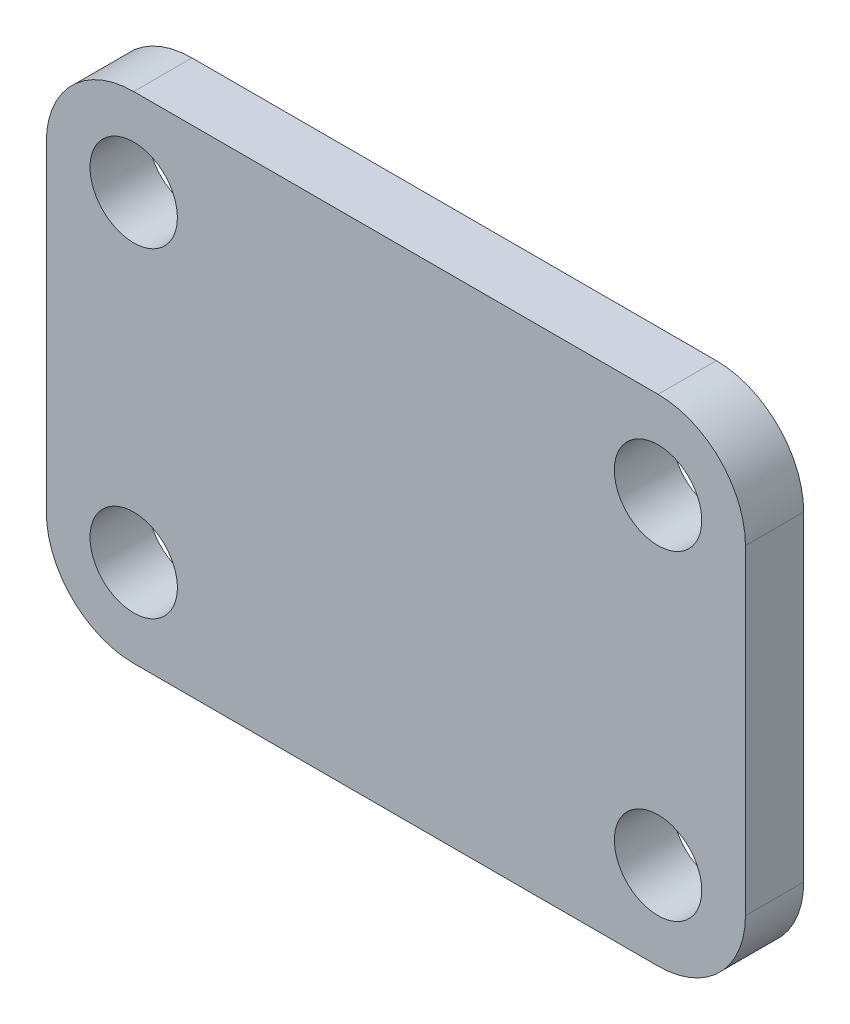
ISO-10303-21;
HEADER;
FILE_DESCRIPTION(('STEP AP214'),'2;1');
FILE_NAME('part.step','',(''),(''),'','','');
FILE_SCHEMA(('AUTOMOTIVE_DESIGN { 1 0 10303 214 1 1 1 1 }'));
ENDSEC;
DATA;
#1=APPLICATION_CONTEXT('core data for automotive mechanical design processes');
#2=APPLICATION_PROTOCOL_DEFINITION('international standard','automotive_design',2000,#1);
#3=PRODUCT_CONTEXT('',#1,'mechanical');
#4=PRODUCT('Part','Part','',(#3));
#5=PRODUCT_RELATED_PRODUCT_CATEGORY('part','',(#4));
#6=PRODUCT_DEFINITION_FORMATION('','',#4);
#7=PRODUCT_DEFINITION_CONTEXT('part definition',#1,'design');
#8=PRODUCT_DEFINITION('design','',#6,#7);
#9=PRODUCT_DEFINITION_SHAPE('','',#8);
#10=(LENGTH_UNIT() NAMED_UNIT(*) SI_UNIT(.MILLI.,.METRE.));
#11=(NAMED_UNIT(*) PLANE_ANGLE_UNIT() SI_UNIT($,.RADIAN.));
#12=(NAMED_UNIT(*) SI_UNIT($,.STERADIAN.) SOLID_ANGLE_UNIT());
#13=UNCERTAINTY_MEASURE_WITH_UNIT(LENGTH_MEASURE(1.E-05),#10,'distance_accuracy_value','');
#14=(GEOMETRIC_REPRESENTATION_CONTEXT(3) GLOBAL_UNCERTAINTY_ASSIGNED_CONTEXT((#13)) GLOBAL_UNIT_ASSIGNED_CONTEXT((#10,
#11,#12)) REPRESENTATION_CONTEXT('',''));
#15=CARTESIAN_POINT('',(0.,0.,0.));
#16=DIRECTION('',(0.,0.,1.));
#17=DIRECTION('',(1.,0.,0.));
#18=AXIS2_PLACEMENT_3D('',#15,#16,#17);
#19=CARTESIAN_POINT('',(0.,0.,1.));
#20=DIRECTION('',(0.,0.,1.));
#21=DIRECTION('',(1.,0.,0.));
#22=AXIS2_PLACEMENT_3D('',#19,#20,#21);
#23=PLANE('',#22);
#24=CARTESIAN_POINT('',(9.,-5.5,1.));
#25=DIRECTION('',(0.,0.,1.));
#26=DIRECTION('',(1.,0.,0.));
#27=AXIS2_PLACEMENT_3D('',#24,#25,#26);
#28=CIRCLE('',#27,1.5);
#29=CARTESIAN_POINT('',(10.5,-5.5,1.));
#30=VERTEX_POINT('',#29);
#31=EDGE_CURVE('E188',#30,#30,#28,.T.);
#32=ORIENTED_EDGE('',*,*,#31,.F.);
#33=EDGE_LOOP('',(#32));
#34=FACE_BOUND('',#33,.T.);
#35=CARTESIAN_POINT('',(-9.,5.5,1.));
#36=DIRECTION('',(0.,0.,1.));
#37=DIRECTION('',(1.,0.,0.));
#38=AXIS2_PLACEMENT_3D('',#35,#36,#37);
#39=CIRCLE('',#38,1.5);
#40=CARTESIAN_POINT('',(-7.5,5.5,1.));
#41=VERTEX_POINT('',#40);
#42=EDGE_CURVE('E129',#41,#41,#39,.T.);
#43=ORIENTED_EDGE('',*,*,#42,.F.);
#44=EDGE_LOOP('',(#43));
#45=FACE_BOUND('',#44,.T.);
#46=DIRECTION('',(1.,0.,0.));
#47=VECTOR('',#46,1.);
#48=CARTESIAN_POINT('',(-12.,-8.5,1.));
#49=LINE('',#48,#47);
#50=CARTESIAN_POINT('',(-9.,-8.5,1.));
#51=VERTEX_POINT('',#50);
#52=CARTESIAN_POINT('',(9.,-8.5,1.));
#53=VERTEX_POINT('',#52);
#54=EDGE_CURVE('E138',#51,#53,#49,.T.);
#55=ORIENTED_EDGE('',*,*,#54,.T.);
#56=CARTESIAN_POINT('',(9.00000000000001,-5.5,1.));
#57=DIRECTION('',(0.,0.,1.));
#58=DIRECTION('',(1.,0.,0.));
#59=AXIS2_PLACEMENT_3D('',#56,#57,#58);
#60=CIRCLE('',#59,3.);
#61=CARTESIAN_POINT('',(12.,-5.5,1.));
#62=VERTEX_POINT('',#61);
#63=EDGE_CURVE('E157',#53,#62,#60,.T.);
#64=ORIENTED_EDGE('',*,*,#63,.T.);
#65=DIRECTION('',(0.,1.,0.));
#66=VECTOR('',#65,1.);
#67=CARTESIAN_POINT('',(12.,8.5,1.));
#68=LINE('',#67,#66);
#69=CARTESIAN_POINT('',(12.,5.5,1.));
#70=VERTEX_POINT('',#69);
#71=EDGE_CURVE('E121',#62,#70,#68,.T.);
#72=ORIENTED_EDGE('',*,*,#71,.T.);
#73=CARTESIAN_POINT('',(9.00000000000001,5.5,1.));
#74=DIRECTION('',(0.,0.,1.));
#75=DIRECTION('',(1.,0.,0.));
#76=AXIS2_PLACEMENT_3D('',#73,#74,#75);
#77=CIRCLE('',#76,3.);
#78=CARTESIAN_POINT('',(9.00000000000001,8.5,1.));
#79=VERTEX_POINT('',#78);
#80=EDGE_CURVE('E152',#70,#79,#77,.T.);
#81=ORIENTED_EDGE('',*,*,#80,.T.);
#82=DIRECTION('',(-1.,0.,0.));
#83=VECTOR('',#82,1.);
#84=CARTESIAN_POINT('',(-12.,8.5,1.));
#85=LINE('',#84,#83);
#86=CARTESIAN_POINT('',(-9.,8.5,1.));
#87=VERTEX_POINT('',#86);
#88=EDGE_CURVE('E168',#79,#87,#85,.T.);
#89=ORIENTED_EDGE('',*,*,#88,.T.);
#90=CARTESIAN_POINT('',(-9.,5.5,1.));
#91=DIRECTION('',(0.,0.,1.));
#92=DIRECTION('',(1.,0.,0.));
#93=AXIS2_PLACEMENT_3D('',#90,#91,#92);
#94=CIRCLE('',#93,3.);
#95=CARTESIAN_POINT('',(-12.,5.5,1.));
#96=VERTEX_POINT('',#95);
#97=EDGE_CURVE('E57',#87,#96,#94,.T.);
#98=ORIENTED_EDGE('',*,*,#97,.T.);
#99=DIRECTION('',(0.,-1.,0.));
#100=VECTOR('',#99,1.);
#101=CARTESIAN_POINT('',(-12.,8.5,1.));
#102=LINE('',#101,#100);
#103=CARTESIAN_POINT('',(-12.,-5.5,1.));
#104=VERTEX_POINT('',#103);
#105=EDGE_CURVE('E176',#96,#104,#102,.T.);
#106=ORIENTED_EDGE('',*,*,#105,.T.);
#107=CARTESIAN_POINT('',(-9.,-5.5,1.));
#108=DIRECTION('',(0.,0.,1.));
#109=DIRECTION('',(1.,0.,0.));
#110=AXIS2_PLACEMENT_3D('',#107,#108,#109);
#111=CIRCLE('',#110,3.);
#112=EDGE_CURVE('E155',#104,#51,#111,.T.);
#113=ORIENTED_EDGE('',*,*,#112,.T.);
#114=EDGE_LOOP('',(#55,#64,#72,#81,#89,#98,#106,#113));
#115=FACE_BOUND('',#114,.T.);
#116=CARTESIAN_POINT('',(9.,5.5,1.));
#117=DIRECTION('',(0.,0.,1.));
#118=DIRECTION('',(-1.,0.,0.));
#119=AXIS2_PLACEMENT_3D('',#116,#117,#118);
#120=CIRCLE('',#119,1.5);
#121=CARTESIAN_POINT('',(7.5,5.5,1.));
#122=VERTEX_POINT('',#121);
#123=EDGE_CURVE('E183',#122,#122,#120,.T.);
#124=ORIENTED_EDGE('',*,*,#123,.F.);
#125=EDGE_LOOP('',(#124));
#126=FACE_BOUND('',#125,.T.);
#127=CARTESIAN_POINT('',(-9.,-5.5,1.));
#128=DIRECTION('',(0.,0.,1.));
#129=DIRECTION('',(-1.,0.,0.));
#130=AXIS2_PLACEMENT_3D('',#127,#128,#129);
#131=CIRCLE('',#130,1.5);
#132=CARTESIAN_POINT('',(-10.5,-5.5,1.));
#133=VERTEX_POINT('',#132);
#134=EDGE_CURVE('E194',#133,#133,#131,.T.);
#135=ORIENTED_EDGE('',*,*,#134,.F.);
#136=EDGE_LOOP('',(#135));
#137=FACE_BOUND('',#136,.T.);
#138=ADVANCED_FACE('F35',(#34,#45,#115,#126,#137),#23,.T.);
#139=CARTESIAN_POINT('',(0.,0.,-1.));
#140=DIRECTION('',(0.,0.,1.));
#141=DIRECTION('',(1.,0.,0.));
#142=AXIS2_PLACEMENT_3D('',#139,#140,#141);
#143=PLANE('',#142);
#144=CARTESIAN_POINT('',(9.,-5.5,-1.));
#145=DIRECTION('',(0.,0.,1.));
#146=DIRECTION('',(1.,0.,0.));
#147=AXIS2_PLACEMENT_3D('',#144,#145,#146);
#148=CIRCLE('',#147,1.5);
#149=CARTESIAN_POINT('',(10.5,-5.5,-1.));
#150=VERTEX_POINT('',#149);
#151=EDGE_CURVE('E191',#150,#150,#148,.T.);
#152=ORIENTED_EDGE('',*,*,#151,.T.);
#153=EDGE_LOOP('',(#152));
#154=FACE_BOUND('',#153,.T.);
#155=CARTESIAN_POINT('',(-9.,5.5,-1.));
#156=DIRECTION('',(0.,0.,1.));
#157=DIRECTION('',(1.,0.,0.));
#158=AXIS2_PLACEMENT_3D('',#155,#156,#157);
#159=CIRCLE('',#158,1.5);
#160=CARTESIAN_POINT('',(-7.5,5.5,-1.));
#161=VERTEX_POINT('',#160);
#162=EDGE_CURVE('E135',#161,#161,#159,.T.);
#163=ORIENTED_EDGE('',*,*,#162,.T.);
#164=EDGE_LOOP('',(#163));
#165=FACE_BOUND('',#164,.T.);
#166=DIRECTION('',(0.,1.,0.));
#167=VECTOR('',#166,1.);
#168=CARTESIAN_POINT('',(12.,8.5,-1.));
#169=LINE('',#168,#167);
#170=CARTESIAN_POINT('',(12.,-5.5,-1.));
#171=VERTEX_POINT('',#170);
#172=CARTESIAN_POINT('',(12.,5.5,-1.));
#173=VERTEX_POINT('',#172);
#174=EDGE_CURVE('E118',#171,#173,#169,.T.);
#175=ORIENTED_EDGE('',*,*,#174,.F.);
#176=CARTESIAN_POINT('',(9.00000000000001,-5.5,-1.));
#177=DIRECTION('',(0.,0.,1.));
#178=DIRECTION('',(1.,0.,0.));
#179=AXIS2_PLACEMENT_3D('',#176,#177,#178);
#180=CIRCLE('',#179,3.);
#181=CARTESIAN_POINT('',(9.,-8.5,-1.));
#182=VERTEX_POINT('',#181);
#183=EDGE_CURVE('E101',#171,#182,#180,.F.);
#184=ORIENTED_EDGE('',*,*,#183,.T.);
#185=DIRECTION('',(1.,0.,0.));
#186=VECTOR('',#185,1.);
#187=CARTESIAN_POINT('',(-12.,-8.5,-1.));
#188=LINE('',#187,#186);
#189=CARTESIAN_POINT('',(-9.,-8.5,-1.));
#190=VERTEX_POINT('',#189);
#191=EDGE_CURVE('E142',#190,#182,#188,.T.);
#192=ORIENTED_EDGE('',*,*,#191,.F.);
#193=CARTESIAN_POINT('',(-9.,-5.5,-1.));
#194=DIRECTION('',(0.,0.,1.));
#195=DIRECTION('',(1.,0.,0.));
#196=AXIS2_PLACEMENT_3D('',#193,#194,#195);
#197=CIRCLE('',#196,3.);
#198=CARTESIAN_POINT('',(-12.,-5.5,-1.));
#199=VERTEX_POINT('',#198);
#200=EDGE_CURVE('E112',#190,#199,#197,.F.);
#201=ORIENTED_EDGE('',*,*,#200,.T.);
#202=DIRECTION('',(0.,-1.,0.));
#203=VECTOR('',#202,1.);
#204=CARTESIAN_POINT('',(-12.,8.5,-1.));
#205=LINE('',#204,#203);
#206=CARTESIAN_POINT('',(-12.,5.5,-1.));
#207=VERTEX_POINT('',#206);
#208=EDGE_CURVE('E132',#207,#199,#205,.T.);
#209=ORIENTED_EDGE('',*,*,#208,.F.);
#210=CARTESIAN_POINT('',(-9.,5.5,-1.));
#211=DIRECTION('',(0.,0.,1.));
#212=DIRECTION('',(1.,0.,0.));
#213=AXIS2_PLACEMENT_3D('',#210,#211,#212);
#214=CIRCLE('',#213,3.);
#215=CARTESIAN_POINT('',(-9.,8.5,-1.));
#216=VERTEX_POINT('',#215);
#217=EDGE_CURVE('E146',#207,#216,#214,.F.);
#218=ORIENTED_EDGE('',*,*,#217,.T.);
#219=DIRECTION('',(-1.,0.,0.));
#220=VECTOR('',#219,1.);
#221=CARTESIAN_POINT('',(-12.,8.5,-1.));
#222=LINE('',#221,#220);
#223=CARTESIAN_POINT('',(9.00000000000001,8.5,-1.));
#224=VERTEX_POINT('',#223);
#225=EDGE_CURVE('E128',#224,#216,#222,.T.);
#226=ORIENTED_EDGE('',*,*,#225,.F.);
#227=CARTESIAN_POINT('',(9.00000000000001,5.5,-1.));
#228=DIRECTION('',(0.,0.,1.));
#229=DIRECTION('',(1.,0.,0.));
#230=AXIS2_PLACEMENT_3D('',#227,#228,#229);
#231=CIRCLE('',#230,3.);
#232=EDGE_CURVE('E122',#224,#173,#231,.F.);
#233=ORIENTED_EDGE('',*,*,#232,.T.);
#234=EDGE_LOOP('',(#175,#184,#192,#201,#209,#218,#226,#233));
#235=FACE_BOUND('',#234,.T.);
#236=CARTESIAN_POINT('',(9.,5.5,-1.));
#237=DIRECTION('',(0.,0.,1.));
#238=DIRECTION('',(-1.,0.,0.));
#239=AXIS2_PLACEMENT_3D('',#236,#237,#238);
#240=CIRCLE('',#239,1.5);
#241=CARTESIAN_POINT('',(7.5,5.5,-1.));
#242=VERTEX_POINT('',#241);
#243=EDGE_CURVE('E185',#242,#242,#240,.T.);
#244=ORIENTED_EDGE('',*,*,#243,.T.);
#245=EDGE_LOOP('',(#244));
#246=FACE_BOUND('',#245,.T.);
#247=CARTESIAN_POINT('',(-9.,-5.5,-1.));
#248=DIRECTION('',(0.,0.,1.));
#249=DIRECTION('',(-1.,0.,0.));
#250=AXIS2_PLACEMENT_3D('',#247,#248,#249);
#251=CIRCLE('',#250,1.5);
#252=CARTESIAN_POINT('',(-10.5,-5.5,-1.));
#253=VERTEX_POINT('',#252);
#254=EDGE_CURVE('E197',#253,#253,#251,.T.);
#255=ORIENTED_EDGE('',*,*,#254,.T.);
#256=EDGE_LOOP('',(#255));
#257=FACE_BOUND('',#256,.T.);
#258=ADVANCED_FACE('F125',(#154,#165,#235,#246,#257),#143,.F.);
#259=CARTESIAN_POINT('',(12.,8.5,1.));
#260=DIRECTION('',(-1.,0.,0.));
#261=DIRECTION('',(0.,-1.,0.));
#262=AXIS2_PLACEMENT_3D('',#259,#260,#261);
#263=PLANE('',#262);
#264=ORIENTED_EDGE('',*,*,#71,.F.);
#265=DIRECTION('',(0.,0.,-1.));
#266=VECTOR('',#265,1.);
#267=CARTESIAN_POINT('',(12.,-5.5,1.));
#268=LINE('',#267,#266);
#269=EDGE_CURVE('E105',#62,#171,#268,.T.);
#270=ORIENTED_EDGE('',*,*,#269,.T.);
#271=ORIENTED_EDGE('',*,*,#174,.T.);
#272=DIRECTION('',(0.,0.,-1.));
#273=VECTOR('',#272,1.);
#274=CARTESIAN_POINT('',(12.,5.5,1.));
#275=LINE('',#274,#273);
#276=EDGE_CURVE('E123',#173,#70,#275,.F.);
#277=ORIENTED_EDGE('',*,*,#276,.T.);
#278=EDGE_LOOP('',(#264,#270,#271,#277));
#279=FACE_BOUND('',#278,.T.);
#280=ADVANCED_FACE('F117',(#279),#263,.F.);
#281=CARTESIAN_POINT('',(-12.,8.5,1.));
#282=DIRECTION('',(0.,-1.,0.));
#283=DIRECTION('',(0.,0.,-1.));
#284=AXIS2_PLACEMENT_3D('',#281,#282,#283);
#285=PLANE('',#284);
#286=ORIENTED_EDGE('',*,*,#225,.T.);
#287=DIRECTION('',(0.,0.,-1.));
#288=VECTOR('',#287,1.);
#289=CARTESIAN_POINT('',(-9.,8.5,1.));
#290=LINE('',#289,#288);
#291=EDGE_CURVE('E11',#216,#87,#290,.F.);
#292=ORIENTED_EDGE('',*,*,#291,.T.);
#293=ORIENTED_EDGE('',*,*,#88,.F.);
#294=DIRECTION('',(0.,0.,-1.));
#295=VECTOR('',#294,1.);
#296=CARTESIAN_POINT('',(9.00000000000001,8.5,1.));
#297=LINE('',#296,#295);
#298=EDGE_CURVE('E43',#79,#224,#297,.T.);
#299=ORIENTED_EDGE('',*,*,#298,.T.);
#300=EDGE_LOOP('',(#286,#292,#293,#299));
#301=FACE_BOUND('',#300,.T.);
#302=ADVANCED_FACE('F166',(#301),#285,.F.);
#303=CARTESIAN_POINT('',(-12.,8.5,1.));
#304=DIRECTION('',(1.,0.,0.));
#305=DIRECTION('',(0.,0.,-1.));
#306=AXIS2_PLACEMENT_3D('',#303,#304,#305);
#307=PLANE('',#306);
#308=ORIENTED_EDGE('',*,*,#208,.T.);
#309=DIRECTION('',(0.,0.,-1.));
#310=VECTOR('',#309,1.);
#311=CARTESIAN_POINT('',(-12.,-5.5,1.));
#312=LINE('',#311,#310);
#313=EDGE_CURVE('E50',#199,#104,#312,.F.);
#314=ORIENTED_EDGE('',*,*,#313,.T.);
#315=ORIENTED_EDGE('',*,*,#105,.F.);
#316=DIRECTION('',(0.,0.,-1.));
#317=VECTOR('',#316,1.);
#318=CARTESIAN_POINT('',(-12.,5.5,1.));
#319=LINE('',#318,#317);
#320=EDGE_CURVE('E159',#96,#207,#319,.T.);
#321=ORIENTED_EDGE('',*,*,#320,.T.);
#322=EDGE_LOOP('',(#308,#314,#315,#321));
#323=FACE_BOUND('',#322,.T.);
#324=ADVANCED_FACE('F175',(#323),#307,.F.);
#325=CARTESIAN_POINT('',(-12.,-8.5,1.));
#326=DIRECTION('',(0.,1.,0.));
#327=DIRECTION('',(0.,0.,1.));
#328=AXIS2_PLACEMENT_3D('',#325,#326,#327);
#329=PLANE('',#328);
#330=ORIENTED_EDGE('',*,*,#191,.T.);
#331=DIRECTION('',(0.,0.,-1.));
#332=VECTOR('',#331,1.);
#333=CARTESIAN_POINT('',(9.00000000000001,-8.5,1.));
#334=LINE('',#333,#332);
#335=EDGE_CURVE('E106',#182,#53,#334,.F.);
#336=ORIENTED_EDGE('',*,*,#335,.T.);
#337=ORIENTED_EDGE('',*,*,#54,.F.);
#338=DIRECTION('',(0.,0.,-1.));
#339=VECTOR('',#338,1.);
#340=CARTESIAN_POINT('',(-9.,-8.5,1.));
#341=LINE('',#340,#339);
#342=EDGE_CURVE('E111',#51,#190,#341,.T.);
#343=ORIENTED_EDGE('',*,*,#342,.T.);
#344=EDGE_LOOP('',(#330,#336,#337,#343));
#345=FACE_BOUND('',#344,.T.);
#346=ADVANCED_FACE('F220',(#345),#329,.F.);
#347=CARTESIAN_POINT('',(-9.,5.5,1.));
#348=DIRECTION('',(0.,0.,-1.));
#349=DIRECTION('',(-1.,0.,0.));
#350=AXIS2_PLACEMENT_3D('',#347,#348,#349);
#351=CYLINDRICAL_SURFACE('',#350,1.5);
#352=ORIENTED_EDGE('',*,*,#42,.T.);
#353=EDGE_LOOP('',(#352));
#354=FACE_BOUND('',#353,.T.);
#355=ORIENTED_EDGE('',*,*,#162,.F.);
#356=EDGE_LOOP('',(#355));
#357=FACE_BOUND('',#356,.T.);
#358=ADVANCED_FACE('F217',(#354,#357),#351,.F.);
#359=CARTESIAN_POINT('',(9.,5.5,1.));
#360=DIRECTION('',(0.,0.,-1.));
#361=DIRECTION('',(-1.,0.,0.));
#362=AXIS2_PLACEMENT_3D('',#359,#360,#361);
#363=CYLINDRICAL_SURFACE('',#362,1.5);
#364=ORIENTED_EDGE('',*,*,#123,.T.);
#365=EDGE_LOOP('',(#364));
#366=FACE_BOUND('',#365,.T.);
#367=ORIENTED_EDGE('',*,*,#243,.F.);
#368=EDGE_LOOP('',(#367));
#369=FACE_BOUND('',#368,.T.);
#370=ADVANCED_FACE('F246',(#366,#369),#363,.F.);
#371=CARTESIAN_POINT('',(9.,-5.5,1.));
#372=DIRECTION('',(0.,0.,-1.));
#373=DIRECTION('',(-1.,0.,0.));
#374=AXIS2_PLACEMENT_3D('',#371,#372,#373);
#375=CYLINDRICAL_SURFACE('',#374,1.5);
#376=ORIENTED_EDGE('',*,*,#31,.T.);
#377=EDGE_LOOP('',(#376));
#378=FACE_BOUND('',#377,.T.);
#379=ORIENTED_EDGE('',*,*,#151,.F.);
#380=EDGE_LOOP('',(#379));
#381=FACE_BOUND('',#380,.T.);
#382=ADVANCED_FACE('F249',(#378,#381),#375,.F.);
#383=CARTESIAN_POINT('',(-9.,-5.5,1.));
#384=DIRECTION('',(0.,0.,-1.));
#385=DIRECTION('',(-1.,0.,0.));
#386=AXIS2_PLACEMENT_3D('',#383,#384,#385);
#387=CYLINDRICAL_SURFACE('',#386,1.5);
#388=ORIENTED_EDGE('',*,*,#134,.T.);
#389=EDGE_LOOP('',(#388));
#390=FACE_BOUND('',#389,.T.);
#391=ORIENTED_EDGE('',*,*,#254,.F.);
#392=EDGE_LOOP('',(#391));
#393=FACE_BOUND('',#392,.T.);
#394=ADVANCED_FACE('F203',(#390,#393),#387,.F.);
#395=CARTESIAN_POINT('',(9.00000000000001,-5.5,1.));
#396=DIRECTION('',(0.,0.,-1.));
#397=DIRECTION('',(-1.,0.,0.));
#398=AXIS2_PLACEMENT_3D('',#395,#396,#397);
#399=CYLINDRICAL_SURFACE('',#398,3.);
#400=ORIENTED_EDGE('',*,*,#63,.F.);
#401=ORIENTED_EDGE('',*,*,#335,.F.);
#402=ORIENTED_EDGE('',*,*,#183,.F.);
#403=ORIENTED_EDGE('',*,*,#269,.F.);
#404=EDGE_LOOP('',(#400,#401,#402,#403));
#405=FACE_BOUND('',#404,.T.);
#406=ADVANCED_FACE('F104',(#405),#399,.T.);
#407=CARTESIAN_POINT('',(-9.,-5.5,1.));
#408=DIRECTION('',(0.,0.,-1.));
#409=DIRECTION('',(-1.,0.,0.));
#410=AXIS2_PLACEMENT_3D('',#407,#408,#409);
#411=CYLINDRICAL_SURFACE('',#410,3.);
#412=ORIENTED_EDGE('',*,*,#112,.F.);
#413=ORIENTED_EDGE('',*,*,#313,.F.);
#414=ORIENTED_EDGE('',*,*,#200,.F.);
#415=ORIENTED_EDGE('',*,*,#342,.F.);
#416=EDGE_LOOP('',(#412,#413,#414,#415));
#417=FACE_BOUND('',#416,.T.);
#418=ADVANCED_FACE('F232',(#417),#411,.T.);
#419=CARTESIAN_POINT('',(-9.,5.5,1.));
#420=DIRECTION('',(0.,0.,-1.));
#421=DIRECTION('',(-1.,0.,0.));
#422=AXIS2_PLACEMENT_3D('',#419,#420,#421);
#423=CYLINDRICAL_SURFACE('',#422,3.);
#424=ORIENTED_EDGE('',*,*,#97,.F.);
#425=ORIENTED_EDGE('',*,*,#291,.F.);
#426=ORIENTED_EDGE('',*,*,#217,.F.);
#427=ORIENTED_EDGE('',*,*,#320,.F.);
#428=EDGE_LOOP('',(#424,#425,#426,#427));
#429=FACE_BOUND('',#428,.T.);
#430=ADVANCED_FACE('F174',(#429),#423,.T.);
#431=CARTESIAN_POINT('',(9.00000000000001,5.5,1.));
#432=DIRECTION('',(0.,0.,-1.));
#433=DIRECTION('',(-1.,0.,0.));
#434=AXIS2_PLACEMENT_3D('',#431,#432,#433);
#435=CYLINDRICAL_SURFACE('',#434,3.);
#436=ORIENTED_EDGE('',*,*,#80,.F.);
#437=ORIENTED_EDGE('',*,*,#276,.F.);
#438=ORIENTED_EDGE('',*,*,#232,.F.);
#439=ORIENTED_EDGE('',*,*,#298,.F.);
#440=EDGE_LOOP('',(#436,#437,#438,#439));
#441=FACE_BOUND('',#440,.T.);
#442=ADVANCED_FACE('F37',(#441),#435,.T.);
#443=CLOSED_SHELL('',(#138,#258,#280,#302,#324,#346,#358,#370,#382,#394,#406,#418,#430,#442));
#444=MANIFOLD_SOLID_BREP('B2',#443);
#445=ADVANCED_BREP_SHAPE_REPRESENTATION('',(#18,#444),#14);
#446=SHAPE_DEFINITION_REPRESENTATION(#9,#445);
ENDSEC;
END-ISO-10303-21;
